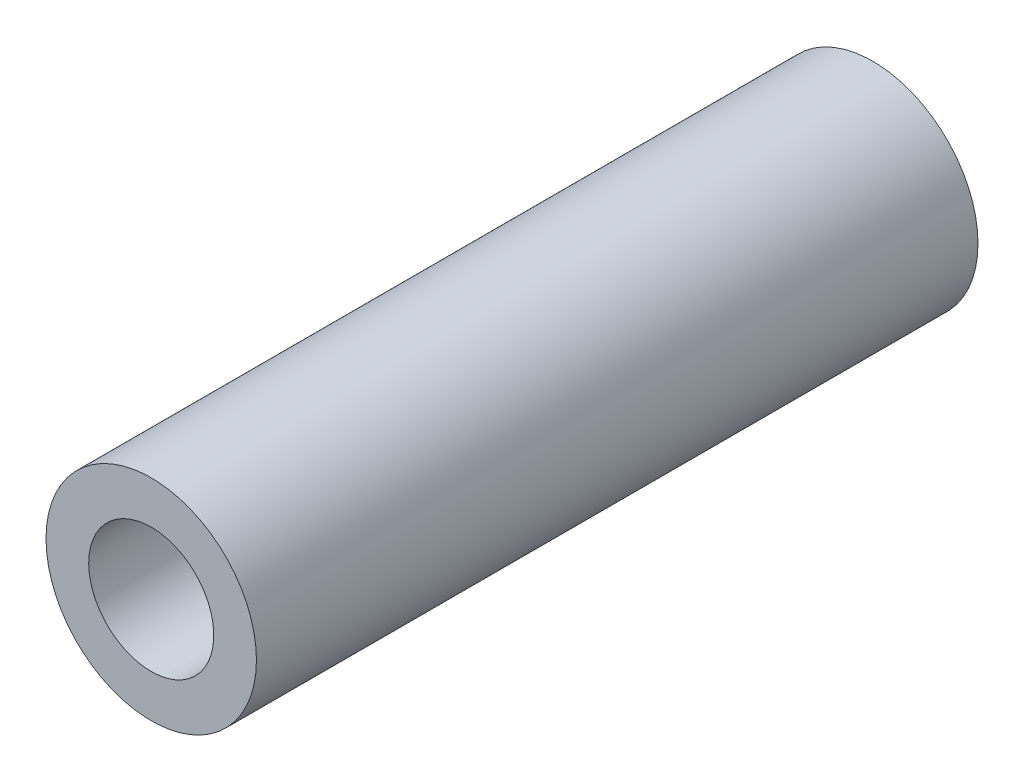
ISO-10303-21;
HEADER;
FILE_DESCRIPTION(('STEP AP214'),'2;1');
FILE_NAME('part.step','',(''),(''),'','','');
FILE_SCHEMA(('AUTOMOTIVE_DESIGN { 1 0 10303 214 1 1 1 1 }'));
ENDSEC;
DATA;
#1=APPLICATION_CONTEXT('core data for automotive mechanical design processes');
#2=APPLICATION_PROTOCOL_DEFINITION('international standard','automotive_design',2000,#1);
#3=PRODUCT_CONTEXT('',#1,'mechanical');
#4=PRODUCT('Part','Part','',(#3));
#5=PRODUCT_RELATED_PRODUCT_CATEGORY('part','',(#4));
#6=PRODUCT_DEFINITION_FORMATION('','',#4);
#7=PRODUCT_DEFINITION_CONTEXT('part definition',#1,'design');
#8=PRODUCT_DEFINITION('design','',#6,#7);
#9=PRODUCT_DEFINITION_SHAPE('','',#8);
#10=(LENGTH_UNIT() NAMED_UNIT(*) SI_UNIT(.MILLI.,.METRE.));
#11=(NAMED_UNIT(*) PLANE_ANGLE_UNIT() SI_UNIT($,.RADIAN.));
#12=(NAMED_UNIT(*) SI_UNIT($,.STERADIAN.) SOLID_ANGLE_UNIT());
#13=UNCERTAINTY_MEASURE_WITH_UNIT(LENGTH_MEASURE(1.E-05),#10,'distance_accuracy_value','');
#14=(GEOMETRIC_REPRESENTATION_CONTEXT(3) GLOBAL_UNCERTAINTY_ASSIGNED_CONTEXT((#13)) GLOBAL_UNIT_ASSIGNED_CONTEXT((#10,
#11,#12)) REPRESENTATION_CONTEXT('',''));
#15=CARTESIAN_POINT('',(0.,0.,0.));
#16=DIRECTION('',(0.,0.,1.));
#17=DIRECTION('',(1.,0.,0.));
#18=AXIS2_PLACEMENT_3D('',#15,#16,#17);
#19=CARTESIAN_POINT('',(0.,0.,38.1));
#20=DIRECTION('',(0.,0.,-1.));
#21=DIRECTION('',(-1.,0.,0.));
#22=AXIS2_PLACEMENT_3D('',#19,#20,#21);
#23=CYLINDRICAL_SURFACE('',#22,3.302);
#24=CARTESIAN_POINT('',(0.,0.,0.));
#25=DIRECTION('',(0.,0.,-1.));
#26=DIRECTION('',(-1.,0.,0.));
#27=AXIS2_PLACEMENT_3D('',#24,#25,#26);
#28=CIRCLE('',#27,3.302);
#29=CARTESIAN_POINT('',(-3.302,0.,0.));
#30=VERTEX_POINT('',#29);
#31=EDGE_CURVE('E27',#30,#30,#28,.T.);
#32=ORIENTED_EDGE('',*,*,#31,.T.);
#33=EDGE_LOOP('',(#32));
#34=FACE_BOUND('',#33,.T.);
#35=CARTESIAN_POINT('',(0.,0.,38.1));
#36=DIRECTION('',(0.,0.,-1.));
#37=DIRECTION('',(-1.,0.,0.));
#38=AXIS2_PLACEMENT_3D('',#35,#36,#37);
#39=CIRCLE('',#38,3.302);
#40=CARTESIAN_POINT('',(-3.302,0.,38.1));
#41=VERTEX_POINT('',#40);
#42=EDGE_CURVE('E18',#41,#41,#39,.T.);
#43=ORIENTED_EDGE('',*,*,#42,.F.);
#44=EDGE_LOOP('',(#43));
#45=FACE_BOUND('',#44,.T.);
#46=ADVANCED_FACE('F15',(#34,#45),#23,.F.);
#47=CARTESIAN_POINT('',(0.,0.,38.1));
#48=DIRECTION('',(0.,0.,1.));
#49=DIRECTION('',(1.,0.,0.));
#50=AXIS2_PLACEMENT_3D('',#47,#48,#49);
#51=PLANE('',#50);
#52=ORIENTED_EDGE('',*,*,#42,.T.);
#53=EDGE_LOOP('',(#52));
#54=FACE_BOUND('',#53,.T.);
#55=CARTESIAN_POINT('',(0.,0.,38.1));
#56=DIRECTION('',(0.,0.,-1.));
#57=DIRECTION('',(-1.,0.,0.));
#58=AXIS2_PLACEMENT_3D('',#55,#56,#57);
#59=CIRCLE('',#58,5.55625);
#60=CARTESIAN_POINT('',(-5.55625,0.,38.1));
#61=VERTEX_POINT('',#60);
#62=EDGE_CURVE('E22',#61,#61,#59,.T.);
#63=ORIENTED_EDGE('',*,*,#62,.F.);
#64=EDGE_LOOP('',(#63));
#65=FACE_BOUND('',#64,.T.);
#66=ADVANCED_FACE('F35',(#54,#65),#51,.T.);
#67=CARTESIAN_POINT('',(0.,0.,0.));
#68=DIRECTION('',(0.,0.,1.));
#69=DIRECTION('',(1.,0.,0.));
#70=AXIS2_PLACEMENT_3D('',#67,#68,#69);
#71=PLANE('',#70);
#72=ORIENTED_EDGE('',*,*,#31,.F.);
#73=EDGE_LOOP('',(#72));
#74=FACE_BOUND('',#73,.T.);
#75=CARTESIAN_POINT('',(0.,0.,0.));
#76=DIRECTION('',(0.,0.,-1.));
#77=DIRECTION('',(-1.,0.,0.));
#78=AXIS2_PLACEMENT_3D('',#75,#76,#77);
#79=CIRCLE('',#78,5.55625);
#80=CARTESIAN_POINT('',(-5.55625,0.,0.));
#81=VERTEX_POINT('',#80);
#82=EDGE_CURVE('E10',#81,#81,#79,.F.);
#83=ORIENTED_EDGE('',*,*,#82,.F.);
#84=EDGE_LOOP('',(#83));
#85=FACE_BOUND('',#84,.T.);
#86=ADVANCED_FACE('F43',(#74,#85),#71,.F.);
#87=CARTESIAN_POINT('',(0.,0.,38.1));
#88=DIRECTION('',(0.,0.,-1.));
#89=DIRECTION('',(-1.,0.,0.));
#90=AXIS2_PLACEMENT_3D('',#87,#88,#89);
#91=CYLINDRICAL_SURFACE('',#90,5.55625);
#92=ORIENTED_EDGE('',*,*,#82,.T.);
#93=EDGE_LOOP('',(#92));
#94=FACE_BOUND('',#93,.T.);
#95=ORIENTED_EDGE('',*,*,#62,.T.);
#96=EDGE_LOOP('',(#95));
#97=FACE_BOUND('',#96,.T.);
#98=ADVANCED_FACE('F44',(#94,#97),#91,.T.);
#99=CLOSED_SHELL('',(#46,#66,#86,#98));
#100=MANIFOLD_SOLID_BREP('B1',#99);
#101=ADVANCED_BREP_SHAPE_REPRESENTATION('',(#18,#100),#14);
#102=SHAPE_DEFINITION_REPRESENTATION(#9,#101);
ENDSEC;
END-ISO-10303-21;
